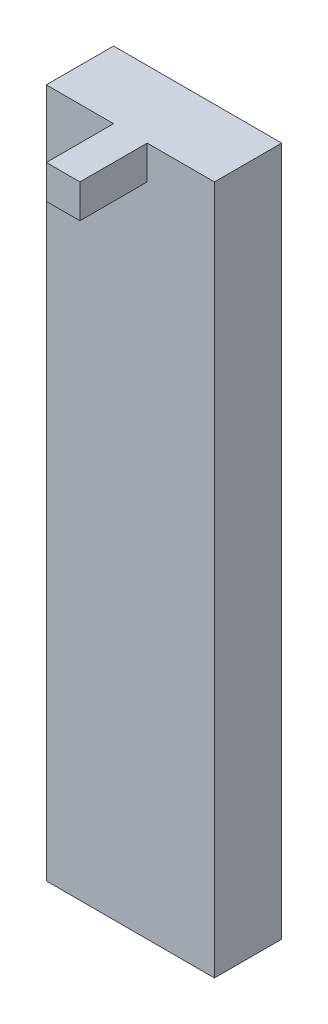
ISO-10303-21;
HEADER;
FILE_DESCRIPTION(('STEP AP214'),'2;1');
FILE_NAME('part.step','',(''),(''),'','','');
FILE_SCHEMA(('AUTOMOTIVE_DESIGN { 1 0 10303 214 1 1 1 1 }'));
ENDSEC;
DATA;
#1=APPLICATION_CONTEXT('core data for automotive mechanical design processes');
#2=APPLICATION_PROTOCOL_DEFINITION('international standard','automotive_design',2000,#1);
#3=PRODUCT_CONTEXT('',#1,'mechanical');
#4=PRODUCT('Part','Part','',(#3));
#5=PRODUCT_RELATED_PRODUCT_CATEGORY('part','',(#4));
#6=PRODUCT_DEFINITION_FORMATION('','',#4);
#7=PRODUCT_DEFINITION_CONTEXT('part definition',#1,'design');
#8=PRODUCT_DEFINITION('design','',#6,#7);
#9=PRODUCT_DEFINITION_SHAPE('','',#8);
#10=(LENGTH_UNIT() NAMED_UNIT(*) SI_UNIT(.MILLI.,.METRE.));
#11=(NAMED_UNIT(*) PLANE_ANGLE_UNIT() SI_UNIT($,.RADIAN.));
#12=(NAMED_UNIT(*) SI_UNIT($,.STERADIAN.) SOLID_ANGLE_UNIT());
#13=UNCERTAINTY_MEASURE_WITH_UNIT(LENGTH_MEASURE(1.E-05),#10,'distance_accuracy_value','');
#14=(GEOMETRIC_REPRESENTATION_CONTEXT(3) GLOBAL_UNCERTAINTY_ASSIGNED_CONTEXT((#13)) GLOBAL_UNIT_ASSIGNED_CONTEXT((#10,
#11,#12)) REPRESENTATION_CONTEXT('',''));
#15=CARTESIAN_POINT('',(0.,0.,0.));
#16=DIRECTION('',(0.,0.,1.));
#17=DIRECTION('',(1.,0.,0.));
#18=AXIS2_PLACEMENT_3D('',#15,#16,#17);
#19=CARTESIAN_POINT('',(0.,102.5,10.));
#20=DIRECTION('',(0.,-1.,0.));
#21=DIRECTION('',(0.,0.,-1.));
#22=AXIS2_PLACEMENT_3D('',#19,#20,#21);
#23=PLANE('',#22);
#24=DIRECTION('',(-1.,0.,0.));
#25=VECTOR('',#24,1.);
#26=CARTESIAN_POINT('',(0.,102.5,0.));
#27=LINE('',#26,#25);
#28=CARTESIAN_POINT('',(0.,102.5,0.));
#29=VERTEX_POINT('',#28);
#30=CARTESIAN_POINT('',(-25.,102.5,0.));
#31=VERTEX_POINT('',#30);
#32=EDGE_CURVE('E79',#29,#31,#27,.T.);
#33=ORIENTED_EDGE('',*,*,#32,.T.);
#34=DIRECTION('',(0.,0.,-1.));
#35=VECTOR('',#34,1.);
#36=CARTESIAN_POINT('',(-25.,102.5,10.));
#37=LINE('',#36,#35);
#38=CARTESIAN_POINT('',(-25.,102.5,10.));
#39=VERTEX_POINT('',#38);
#40=EDGE_CURVE('E11',#39,#31,#37,.T.);
#41=ORIENTED_EDGE('',*,*,#40,.F.);
#42=DIRECTION('',(-1.,0.,0.));
#43=VECTOR('',#42,1.);
#44=CARTESIAN_POINT('',(0.,102.5,10.));
#45=LINE('',#44,#43);
#46=CARTESIAN_POINT('',(-15.,102.5,10.));
#47=VERTEX_POINT('',#46);
#48=EDGE_CURVE('E114',#47,#39,#45,.T.);
#49=ORIENTED_EDGE('',*,*,#48,.F.);
#50=DIRECTION('',(0.,0.,-1.));
#51=VECTOR('',#50,1.);
#52=CARTESIAN_POINT('',(-15.,102.5,20.));
#53=LINE('',#52,#51);
#54=CARTESIAN_POINT('',(-15.,102.5,20.));
#55=VERTEX_POINT('',#54);
#56=EDGE_CURVE('E128',#55,#47,#53,.T.);
#57=ORIENTED_EDGE('',*,*,#56,.F.);
#58=DIRECTION('',(1.,0.,0.));
#59=VECTOR('',#58,1.);
#60=CARTESIAN_POINT('',(-15.,102.5,20.));
#61=LINE('',#60,#59);
#62=CARTESIAN_POINT('',(-10.,102.5,20.));
#63=VERTEX_POINT('',#62);
#64=EDGE_CURVE('E224',#55,#63,#61,.T.);
#65=ORIENTED_EDGE('',*,*,#64,.T.);
#66=DIRECTION('',(0.,0.,-1.));
#67=VECTOR('',#66,1.);
#68=CARTESIAN_POINT('',(-10.,102.5,20.));
#69=LINE('',#68,#67);
#70=CARTESIAN_POINT('',(-10.,102.5,10.));
#71=VERTEX_POINT('',#70);
#72=EDGE_CURVE('E244',#63,#71,#69,.T.);
#73=ORIENTED_EDGE('',*,*,#72,.T.);
#74=CARTESIAN_POINT('',(0.,102.5,10.));
#75=VERTEX_POINT('',#74);
#76=EDGE_CURVE('E84',#75,#71,#45,.T.);
#77=ORIENTED_EDGE('',*,*,#76,.F.);
#78=DIRECTION('',(0.,0.,-1.));
#79=VECTOR('',#78,1.);
#80=CARTESIAN_POINT('',(0.,102.5,10.));
#81=LINE('',#80,#79);
#82=EDGE_CURVE('E122',#75,#29,#81,.T.);
#83=ORIENTED_EDGE('',*,*,#82,.T.);
#84=EDGE_LOOP('',(#33,#41,#49,#57,#65,#73,#77,#83));
#85=FACE_BOUND('',#84,.T.);
#86=ADVANCED_FACE('F39',(#85),#23,.F.);
#87=CARTESIAN_POINT('',(-25.,0.,10.));
#88=DIRECTION('',(-1.,0.,0.));
#89=DIRECTION('',(0.,0.,1.));
#90=AXIS2_PLACEMENT_3D('',#87,#88,#89);
#91=PLANE('',#90);
#92=DIRECTION('',(0.,1.,0.));
#93=VECTOR('',#92,1.);
#94=CARTESIAN_POINT('',(-25.,0.,0.));
#95=LINE('',#94,#93);
#96=CARTESIAN_POINT('',(-25.,0.,0.));
#97=VERTEX_POINT('',#96);
#98=EDGE_CURVE('E105',#97,#31,#95,.T.);
#99=ORIENTED_EDGE('',*,*,#98,.F.);
#100=DIRECTION('',(0.,0.,-1.));
#101=VECTOR('',#100,1.);
#102=CARTESIAN_POINT('',(-25.,0.,10.));
#103=LINE('',#102,#101);
#104=CARTESIAN_POINT('',(-25.,0.,10.));
#105=VERTEX_POINT('',#104);
#106=EDGE_CURVE('E48',#105,#97,#103,.T.);
#107=ORIENTED_EDGE('',*,*,#106,.F.);
#108=DIRECTION('',(0.,1.,0.));
#109=VECTOR('',#108,1.);
#110=CARTESIAN_POINT('',(-25.,0.,10.));
#111=LINE('',#110,#109);
#112=EDGE_CURVE('E104',#105,#39,#111,.T.);
#113=ORIENTED_EDGE('',*,*,#112,.T.);
#114=ORIENTED_EDGE('',*,*,#40,.T.);
#115=EDGE_LOOP('',(#99,#107,#113,#114));
#116=FACE_BOUND('',#115,.T.);
#117=ADVANCED_FACE('F103',(#116),#91,.T.);
#118=CARTESIAN_POINT('',(0.,0.,10.));
#119=DIRECTION('',(0.,-1.,0.));
#120=DIRECTION('',(0.,0.,-1.));
#121=AXIS2_PLACEMENT_3D('',#118,#119,#120);
#122=PLANE('',#121);
#123=DIRECTION('',(-1.,0.,0.));
#124=VECTOR('',#123,1.);
#125=CARTESIAN_POINT('',(0.,0.,0.));
#126=LINE('',#125,#124);
#127=CARTESIAN_POINT('',(0.,0.,0.));
#128=VERTEX_POINT('',#127);
#129=EDGE_CURVE('E131',#128,#97,#126,.T.);
#130=ORIENTED_EDGE('',*,*,#129,.F.);
#131=DIRECTION('',(0.,0.,-1.));
#132=VECTOR('',#131,1.);
#133=CARTESIAN_POINT('',(0.,0.,10.));
#134=LINE('',#133,#132);
#135=CARTESIAN_POINT('',(0.,0.,10.));
#136=VERTEX_POINT('',#135);
#137=EDGE_CURVE('E72',#136,#128,#134,.T.);
#138=ORIENTED_EDGE('',*,*,#137,.F.);
#139=DIRECTION('',(-1.,0.,0.));
#140=VECTOR('',#139,1.);
#141=CARTESIAN_POINT('',(0.,0.,10.));
#142=LINE('',#141,#140);
#143=EDGE_CURVE('E112',#136,#105,#142,.T.);
#144=ORIENTED_EDGE('',*,*,#143,.T.);
#145=ORIENTED_EDGE('',*,*,#106,.T.);
#146=EDGE_LOOP('',(#130,#138,#144,#145));
#147=FACE_BOUND('',#146,.T.);
#148=ADVANCED_FACE('F118',(#147),#122,.T.);
#149=CARTESIAN_POINT('',(0.,0.,10.));
#150=DIRECTION('',(-1.,0.,0.));
#151=DIRECTION('',(0.,0.,1.));
#152=AXIS2_PLACEMENT_3D('',#149,#150,#151);
#153=PLANE('',#152);
#154=DIRECTION('',(0.,1.,0.));
#155=VECTOR('',#154,1.);
#156=CARTESIAN_POINT('',(0.,0.,0.));
#157=LINE('',#156,#155);
#158=EDGE_CURVE('E134',#128,#29,#157,.T.);
#159=ORIENTED_EDGE('',*,*,#158,.T.);
#160=ORIENTED_EDGE('',*,*,#82,.F.);
#161=DIRECTION('',(0.,1.,0.));
#162=VECTOR('',#161,1.);
#163=CARTESIAN_POINT('',(0.,0.,10.));
#164=LINE('',#163,#162);
#165=EDGE_CURVE('E56',#136,#75,#164,.T.);
#166=ORIENTED_EDGE('',*,*,#165,.F.);
#167=ORIENTED_EDGE('',*,*,#137,.T.);
#168=EDGE_LOOP('',(#159,#160,#166,#167));
#169=FACE_BOUND('',#168,.T.);
#170=ADVANCED_FACE('F143',(#169),#153,.F.);
#171=CARTESIAN_POINT('',(0.,0.,10.));
#172=DIRECTION('',(0.,0.,1.));
#173=DIRECTION('',(1.,0.,0.));
#174=AXIS2_PLACEMENT_3D('',#171,#172,#173);
#175=PLANE('',#174);
#176=ORIENTED_EDGE('',*,*,#76,.T.);
#177=DIRECTION('',(0.,-1.,0.));
#178=VECTOR('',#177,1.);
#179=CARTESIAN_POINT('',(-9.99999999999997,0.,10.));
#180=LINE('',#179,#178);
#181=CARTESIAN_POINT('',(-10.,97.5,10.));
#182=VERTEX_POINT('',#181);
#183=EDGE_CURVE('E260',#71,#182,#180,.T.);
#184=ORIENTED_EDGE('',*,*,#183,.T.);
#185=DIRECTION('',(1.,0.,0.));
#186=VECTOR('',#185,1.);
#187=CARTESIAN_POINT('',(0.,97.5,10.));
#188=LINE('',#187,#186);
#189=CARTESIAN_POINT('',(-15.,97.5,10.));
#190=VERTEX_POINT('',#189);
#191=EDGE_CURVE('E263',#190,#182,#188,.T.);
#192=ORIENTED_EDGE('',*,*,#191,.F.);
#193=DIRECTION('',(0.,-1.,0.));
#194=VECTOR('',#193,1.);
#195=CARTESIAN_POINT('',(-15.,0.,10.));
#196=LINE('',#195,#194);
#197=EDGE_CURVE('E266',#47,#190,#196,.T.);
#198=ORIENTED_EDGE('',*,*,#197,.F.);
#199=ORIENTED_EDGE('',*,*,#48,.T.);
#200=ORIENTED_EDGE('',*,*,#112,.F.);
#201=ORIENTED_EDGE('',*,*,#143,.F.);
#202=ORIENTED_EDGE('',*,*,#165,.T.);
#203=EDGE_LOOP('',(#176,#184,#192,#198,#199,#200,#201,#202));
#204=FACE_BOUND('',#203,.T.);
#205=ADVANCED_FACE('F111',(#204),#175,.T.);
#206=CARTESIAN_POINT('',(0.,0.,0.));
#207=DIRECTION('',(0.,0.,1.));
#208=DIRECTION('',(1.,0.,0.));
#209=AXIS2_PLACEMENT_3D('',#206,#207,#208);
#210=PLANE('',#209);
#211=ORIENTED_EDGE('',*,*,#32,.F.);
#212=ORIENTED_EDGE('',*,*,#158,.F.);
#213=ORIENTED_EDGE('',*,*,#129,.T.);
#214=ORIENTED_EDGE('',*,*,#98,.T.);
#215=EDGE_LOOP('',(#211,#212,#213,#214));
#216=FACE_BOUND('',#215,.T.);
#217=ADVANCED_FACE('F144',(#216),#210,.F.);
#218=CARTESIAN_POINT('',(-15.,102.5,20.));
#219=DIRECTION('',(1.,0.,0.));
#220=DIRECTION('',(0.,0.,-1.));
#221=AXIS2_PLACEMENT_3D('',#218,#219,#220);
#222=PLANE('',#221);
#223=ORIENTED_EDGE('',*,*,#197,.T.);
#224=DIRECTION('',(0.,0.,-1.));
#225=VECTOR('',#224,1.);
#226=CARTESIAN_POINT('',(-15.,97.5,20.));
#227=LINE('',#226,#225);
#228=CARTESIAN_POINT('',(-15.,97.5,20.));
#229=VERTEX_POINT('',#228);
#230=EDGE_CURVE('E248',#229,#190,#227,.T.);
#231=ORIENTED_EDGE('',*,*,#230,.F.);
#232=DIRECTION('',(0.,-1.,0.));
#233=VECTOR('',#232,1.);
#234=CARTESIAN_POINT('',(-15.,102.5,20.));
#235=LINE('',#234,#233);
#236=EDGE_CURVE('E228',#55,#229,#235,.T.);
#237=ORIENTED_EDGE('',*,*,#236,.F.);
#238=ORIENTED_EDGE('',*,*,#56,.T.);
#239=EDGE_LOOP('',(#223,#231,#237,#238));
#240=FACE_BOUND('',#239,.T.);
#241=ADVANCED_FACE('F146',(#240),#222,.F.);
#242=CARTESIAN_POINT('',(-15.,97.5,20.));
#243=DIRECTION('',(0.,1.,0.));
#244=DIRECTION('',(0.,0.,1.));
#245=AXIS2_PLACEMENT_3D('',#242,#243,#244);
#246=PLANE('',#245);
#247=ORIENTED_EDGE('',*,*,#191,.T.);
#248=DIRECTION('',(0.,0.,-1.));
#249=VECTOR('',#248,1.);
#250=CARTESIAN_POINT('',(-10.,97.5,20.));
#251=LINE('',#250,#249);
#252=CARTESIAN_POINT('',(-10.,97.5,20.));
#253=VERTEX_POINT('',#252);
#254=EDGE_CURVE('E252',#253,#182,#251,.T.);
#255=ORIENTED_EDGE('',*,*,#254,.F.);
#256=DIRECTION('',(1.,0.,0.));
#257=VECTOR('',#256,1.);
#258=CARTESIAN_POINT('',(-15.,97.5,20.));
#259=LINE('',#258,#257);
#260=EDGE_CURVE('E237',#229,#253,#259,.T.);
#261=ORIENTED_EDGE('',*,*,#260,.F.);
#262=ORIENTED_EDGE('',*,*,#230,.T.);
#263=EDGE_LOOP('',(#247,#255,#261,#262));
#264=FACE_BOUND('',#263,.T.);
#265=ADVANCED_FACE('F152',(#264),#246,.F.);
#266=CARTESIAN_POINT('',(-10.,102.5,20.));
#267=DIRECTION('',(1.,0.,0.));
#268=DIRECTION('',(0.,1.,0.));
#269=AXIS2_PLACEMENT_3D('',#266,#267,#268);
#270=PLANE('',#269);
#271=ORIENTED_EDGE('',*,*,#254,.T.);
#272=ORIENTED_EDGE('',*,*,#183,.F.);
#273=ORIENTED_EDGE('',*,*,#72,.F.);
#274=DIRECTION('',(0.,-1.,0.));
#275=VECTOR('',#274,1.);
#276=CARTESIAN_POINT('',(-10.,102.5,20.));
#277=LINE('',#276,#275);
#278=EDGE_CURVE('E232',#63,#253,#277,.T.);
#279=ORIENTED_EDGE('',*,*,#278,.T.);
#280=EDGE_LOOP('',(#271,#272,#273,#279));
#281=FACE_BOUND('',#280,.T.);
#282=ADVANCED_FACE('F196',(#281),#270,.T.);
#283=CARTESIAN_POINT('',(0.,0.,20.));
#284=DIRECTION('',(0.,0.,-1.));
#285=DIRECTION('',(-1.,0.,0.));
#286=AXIS2_PLACEMENT_3D('',#283,#284,#285);
#287=PLANE('',#286);
#288=ORIENTED_EDGE('',*,*,#64,.F.);
#289=ORIENTED_EDGE('',*,*,#236,.T.);
#290=ORIENTED_EDGE('',*,*,#260,.T.);
#291=ORIENTED_EDGE('',*,*,#278,.F.);
#292=EDGE_LOOP('',(#288,#289,#290,#291));
#293=FACE_BOUND('',#292,.T.);
#294=ADVANCED_FACE('F206',(#293),#287,.F.);
#295=CLOSED_SHELL('',(#86,#117,#148,#170,#205,#217,#241,#265,#282,#294));
#296=MANIFOLD_SOLID_BREP('B2',#295);
#297=ADVANCED_BREP_SHAPE_REPRESENTATION('',(#18,#296),#14);
#298=SHAPE_DEFINITION_REPRESENTATION(#9,#297);
ENDSEC;
END-ISO-10303-21;
